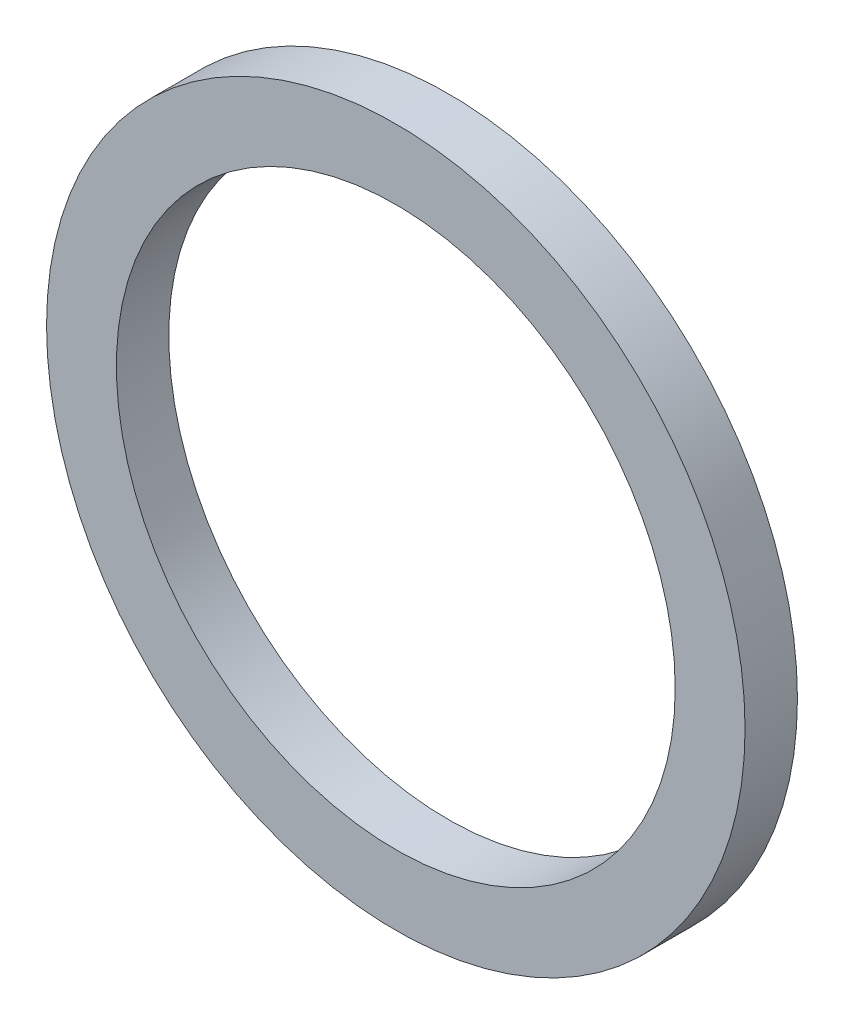
ISO-10303-21;
HEADER;
FILE_DESCRIPTION(('STEP AP214'),'2;1');
FILE_NAME('part.step','',(''),(''),'','','');
FILE_SCHEMA(('AUTOMOTIVE_DESIGN { 1 0 10303 214 1 1 1 1 }'));
ENDSEC;
DATA;
#1=APPLICATION_CONTEXT('core data for automotive mechanical design processes');
#2=APPLICATION_PROTOCOL_DEFINITION('international standard','automotive_design',2000,#1);
#3=PRODUCT_CONTEXT('',#1,'mechanical');
#4=PRODUCT('Part','Part','',(#3));
#5=PRODUCT_RELATED_PRODUCT_CATEGORY('part','',(#4));
#6=PRODUCT_DEFINITION_FORMATION('','',#4);
#7=PRODUCT_DEFINITION_CONTEXT('part definition',#1,'design');
#8=PRODUCT_DEFINITION('design','',#6,#7);
#9=PRODUCT_DEFINITION_SHAPE('','',#8);
#10=(LENGTH_UNIT() NAMED_UNIT(*) SI_UNIT(.MILLI.,.METRE.));
#11=(NAMED_UNIT(*) PLANE_ANGLE_UNIT() SI_UNIT($,.RADIAN.));
#12=(NAMED_UNIT(*) SI_UNIT($,.STERADIAN.) SOLID_ANGLE_UNIT());
#13=UNCERTAINTY_MEASURE_WITH_UNIT(LENGTH_MEASURE(1.E-05),#10,'distance_accuracy_value','');
#14=(GEOMETRIC_REPRESENTATION_CONTEXT(3) GLOBAL_UNCERTAINTY_ASSIGNED_CONTEXT((#13)) GLOBAL_UNIT_ASSIGNED_CONTEXT((#10,
#11,#12)) REPRESENTATION_CONTEXT('',''));
#15=CARTESIAN_POINT('',(0.,0.,0.));
#16=DIRECTION('',(0.,0.,1.));
#17=DIRECTION('',(1.,0.,0.));
#18=AXIS2_PLACEMENT_3D('',#15,#16,#17);
#19=CARTESIAN_POINT('',(0.,0.,0.));
#20=DIRECTION('',(0.,0.,1.));
#21=DIRECTION('',(1.,0.,0.));
#22=AXIS2_PLACEMENT_3D('',#19,#20,#21);
#23=CYLINDRICAL_SURFACE('',#22,15.);
#24=CARTESIAN_POINT('',(0.,0.,0.));
#25=DIRECTION('',(0.,0.,1.));
#26=DIRECTION('',(1.,0.,0.));
#27=AXIS2_PLACEMENT_3D('',#24,#25,#26);
#28=CIRCLE('',#27,15.);
#29=CARTESIAN_POINT('',(15.,0.,0.));
#30=VERTEX_POINT('',#29);
#31=EDGE_CURVE('E53',#30,#30,#28,.T.);
#32=ORIENTED_EDGE('',*,*,#31,.F.);
#33=EDGE_LOOP('',(#32));
#34=FACE_BOUND('',#33,.T.);
#35=CARTESIAN_POINT('',(0.,0.,-2.25));
#36=DIRECTION('',(0.,0.,1.));
#37=DIRECTION('',(1.,0.,0.));
#38=AXIS2_PLACEMENT_3D('',#35,#36,#37);
#39=CIRCLE('',#38,15.);
#40=CARTESIAN_POINT('',(15.,0.,-2.25));
#41=VERTEX_POINT('',#40);
#42=EDGE_CURVE('E10',#41,#41,#39,.T.);
#43=ORIENTED_EDGE('',*,*,#42,.T.);
#44=EDGE_LOOP('',(#43));
#45=FACE_BOUND('',#44,.T.);
#46=ADVANCED_FACE('F39',(#34,#45),#23,.T.);
#47=CARTESIAN_POINT('',(0.,0.,1.62785714285714));
#48=DIRECTION('',(0.,0.,1.));
#49=DIRECTION('',(1.,0.,0.));
#50=AXIS2_PLACEMENT_3D('',#47,#48,#49);
#51=TOROIDAL_SURFACE('',#50,13.5,4.15785714285714);
#52=ORIENTED_EDGE('',*,*,#42,.F.);
#53=EDGE_LOOP('',(#52));
#54=FACE_BOUND('',#53,.T.);
#55=CARTESIAN_POINT('',(0.,0.,-2.25));
#56=DIRECTION('',(0.,0.,1.));
#57=DIRECTION('',(1.,0.,0.));
#58=AXIS2_PLACEMENT_3D('',#55,#56,#57);
#59=CIRCLE('',#58,12.);
#60=CARTESIAN_POINT('',(12.,0.,-2.25));
#61=VERTEX_POINT('',#60);
#62=EDGE_CURVE('E45',#61,#61,#59,.T.);
#63=ORIENTED_EDGE('',*,*,#62,.T.);
#64=EDGE_LOOP('',(#63));
#65=FACE_BOUND('',#64,.T.);
#66=ADVANCED_FACE('F62',(#54,#65),#51,.T.);
#67=CARTESIAN_POINT('',(0.,0.,0.));
#68=DIRECTION('',(0.,0.,1.));
#69=DIRECTION('',(1.,0.,0.));
#70=AXIS2_PLACEMENT_3D('',#67,#68,#69);
#71=CYLINDRICAL_SURFACE('',#70,12.);
#72=ORIENTED_EDGE('',*,*,#62,.F.);
#73=EDGE_LOOP('',(#72));
#74=FACE_BOUND('',#73,.T.);
#75=CARTESIAN_POINT('',(0.,0.,0.));
#76=DIRECTION('',(0.,0.,1.));
#77=DIRECTION('',(1.,0.,0.));
#78=AXIS2_PLACEMENT_3D('',#75,#76,#77);
#79=CIRCLE('',#78,12.);
#80=CARTESIAN_POINT('',(12.,0.,0.));
#81=VERTEX_POINT('',#80);
#82=EDGE_CURVE('E49',#81,#81,#79,.T.);
#83=ORIENTED_EDGE('',*,*,#82,.T.);
#84=EDGE_LOOP('',(#83));
#85=FACE_BOUND('',#84,.T.);
#86=ADVANCED_FACE('F66',(#74,#85),#71,.F.);
#87=CARTESIAN_POINT('',(0.,15.,0.));
#88=DIRECTION('',(0.,0.,-1.));
#89=DIRECTION('',(-1.,0.,0.));
#90=AXIS2_PLACEMENT_3D('',#87,#88,#89);
#91=PLANE('',#90);
#92=ORIENTED_EDGE('',*,*,#82,.F.);
#93=EDGE_LOOP('',(#92));
#94=FACE_BOUND('',#93,.T.);
#95=ORIENTED_EDGE('',*,*,#31,.T.);
#96=EDGE_LOOP('',(#95));
#97=FACE_BOUND('',#96,.T.);
#98=ADVANCED_FACE('F59',(#94,#97),#91,.F.);
#99=CLOSED_SHELL('',(#46,#66,#86,#98));
#100=MANIFOLD_SOLID_BREP('B2',#99);
#101=ADVANCED_BREP_SHAPE_REPRESENTATION('',(#18,#100),#14);
#102=SHAPE_DEFINITION_REPRESENTATION(#9,#101);
ENDSEC;
END-ISO-10303-21;
